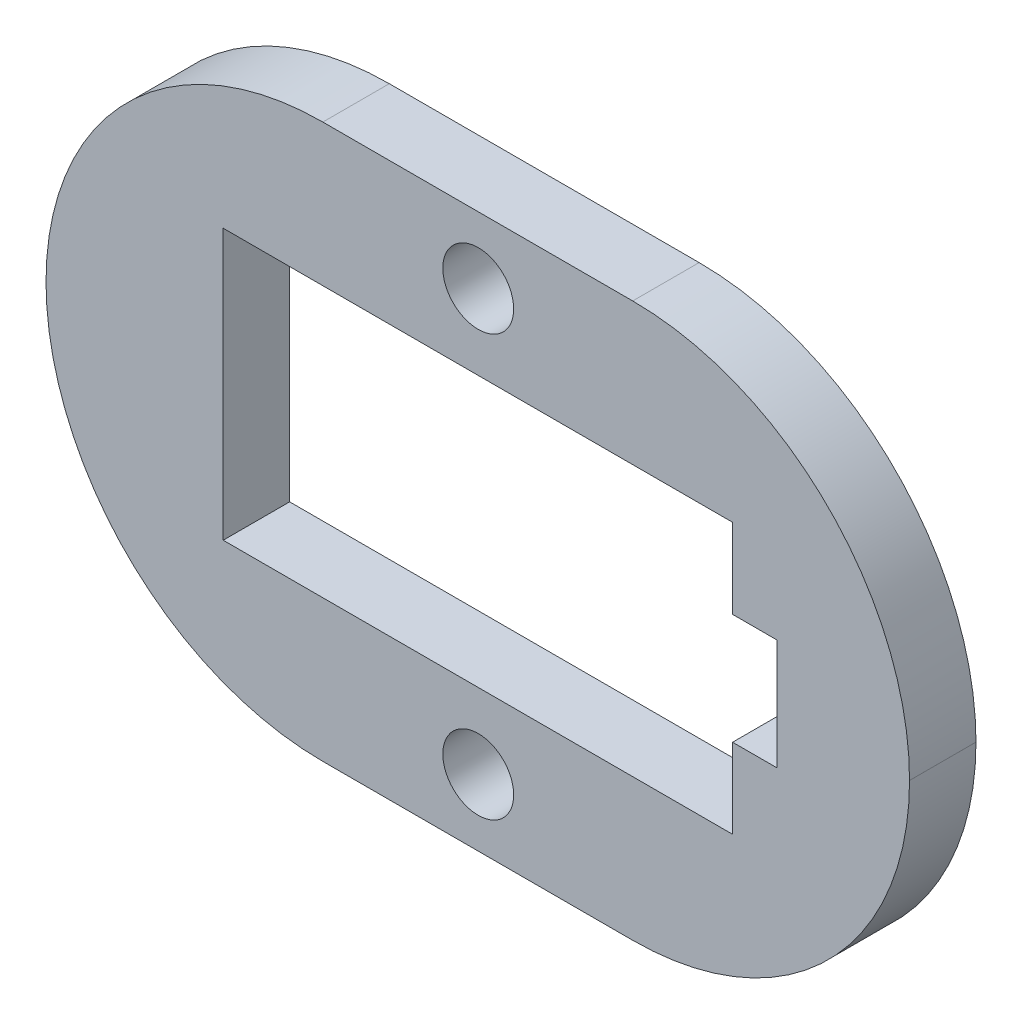
ISO-10303-21;
HEADER;
FILE_DESCRIPTION(('STEP AP214'),'2;1');
FILE_NAME('part.step','',(''),(''),'','','');
FILE_SCHEMA(('AUTOMOTIVE_DESIGN { 1 0 10303 214 1 1 1 1 }'));
ENDSEC;
DATA;
#1=APPLICATION_CONTEXT('core data for automotive mechanical design processes');
#2=APPLICATION_PROTOCOL_DEFINITION('international standard','automotive_design',2000,#1);
#3=PRODUCT_CONTEXT('',#1,'mechanical');
#4=PRODUCT('Part','Part','',(#3));
#5=PRODUCT_RELATED_PRODUCT_CATEGORY('part','',(#4));
#6=PRODUCT_DEFINITION_FORMATION('','',#4);
#7=PRODUCT_DEFINITION_CONTEXT('part definition',#1,'design');
#8=PRODUCT_DEFINITION('design','',#6,#7);
#9=PRODUCT_DEFINITION_SHAPE('','',#8);
#10=(LENGTH_UNIT() NAMED_UNIT(*) SI_UNIT(.MILLI.,.METRE.));
#11=(NAMED_UNIT(*) PLANE_ANGLE_UNIT() SI_UNIT($,.RADIAN.));
#12=(NAMED_UNIT(*) SI_UNIT($,.STERADIAN.) SOLID_ANGLE_UNIT());
#13=UNCERTAINTY_MEASURE_WITH_UNIT(LENGTH_MEASURE(1.E-05),#10,'distance_accuracy_value','');
#14=(GEOMETRIC_REPRESENTATION_CONTEXT(3) GLOBAL_UNCERTAINTY_ASSIGNED_CONTEXT((#13)) GLOBAL_UNIT_ASSIGNED_CONTEXT((#10,
#11,#12)) REPRESENTATION_CONTEXT('',''));
#15=CARTESIAN_POINT('',(0.,0.,0.));
#16=DIRECTION('',(0.,0.,1.));
#17=DIRECTION('',(1.,0.,0.));
#18=AXIS2_PLACEMENT_3D('',#15,#16,#17);
#19=CARTESIAN_POINT('',(-8.50332149258777,12.5,3.));
#20=DIRECTION('',(0.,0.,-1.));
#21=DIRECTION('',(-1.,0.,0.));
#22=AXIS2_PLACEMENT_3D('',#19,#20,#21);
#23=CYLINDRICAL_SURFACE('',#22,12.5);
#24=CARTESIAN_POINT('',(-8.50332149258777,12.5,0.));
#25=DIRECTION('',(0.,0.,-1.));
#26=DIRECTION('',(-1.,0.,0.));
#27=AXIS2_PLACEMENT_3D('',#24,#25,#26);
#28=CIRCLE('',#27,12.5);
#29=CARTESIAN_POINT('',(-8.50332149258777,0.,0.));
#30=VERTEX_POINT('',#29);
#31=CARTESIAN_POINT('',(-21.0033214925878,12.5,0.));
#32=VERTEX_POINT('',#31);
#33=EDGE_CURVE('E226',#30,#32,#28,.T.);
#34=ORIENTED_EDGE('',*,*,#33,.F.);
#35=DIRECTION('',(0.,0.,-1.));
#36=VECTOR('',#35,1.);
#37=CARTESIAN_POINT('',(-8.50332149258777,0.,3.));
#38=LINE('',#37,#36);
#39=CARTESIAN_POINT('',(-8.50332149258777,0.,3.));
#40=VERTEX_POINT('',#39);
#41=EDGE_CURVE('E11',#40,#30,#38,.T.);
#42=ORIENTED_EDGE('',*,*,#41,.F.);
#43=CARTESIAN_POINT('',(-8.50332149258777,12.5,3.));
#44=DIRECTION('',(0.,0.,-1.));
#45=DIRECTION('',(-1.,0.,0.));
#46=AXIS2_PLACEMENT_3D('',#43,#44,#45);
#47=CIRCLE('',#46,12.5);
#48=CARTESIAN_POINT('',(-21.0033214925878,12.5,3.));
#49=VERTEX_POINT('',#48);
#50=EDGE_CURVE('E244',#40,#49,#47,.T.);
#51=ORIENTED_EDGE('',*,*,#50,.T.);
#52=DIRECTION('',(0.,0.,-1.));
#53=VECTOR('',#52,1.);
#54=CARTESIAN_POINT('',(-21.0033214925878,12.5,3.));
#55=LINE('',#54,#53);
#56=EDGE_CURVE('E42',#49,#32,#55,.T.);
#57=ORIENTED_EDGE('',*,*,#56,.T.);
#58=EDGE_LOOP('',(#34,#42,#51,#57));
#59=FACE_BOUND('',#58,.T.);
#60=ADVANCED_FACE('F39',(#59),#23,.T.);
#61=CARTESIAN_POINT('',(5.48658919269266,0.,3.));
#62=DIRECTION('',(0.,-1.,0.));
#63=DIRECTION('',(0.,0.,-1.));
#64=AXIS2_PLACEMENT_3D('',#61,#62,#63);
#65=PLANE('',#64);
#66=DIRECTION('',(-1.,0.,0.));
#67=VECTOR('',#66,1.);
#68=CARTESIAN_POINT('',(5.48658919269266,0.,0.));
#69=LINE('',#68,#67);
#70=CARTESIAN_POINT('',(5.48658919269266,0.,0.));
#71=VERTEX_POINT('',#70);
#72=EDGE_CURVE('E249',#71,#30,#69,.T.);
#73=ORIENTED_EDGE('',*,*,#72,.F.);
#74=DIRECTION('',(0.,0.,-1.));
#75=VECTOR('',#74,1.);
#76=CARTESIAN_POINT('',(5.48658919269266,0.,3.));
#77=LINE('',#76,#75);
#78=CARTESIAN_POINT('',(5.48658919269266,0.,3.));
#79=VERTEX_POINT('',#78);
#80=EDGE_CURVE('E48',#79,#71,#77,.T.);
#81=ORIENTED_EDGE('',*,*,#80,.F.);
#82=DIRECTION('',(-1.,0.,0.));
#83=VECTOR('',#82,1.);
#84=CARTESIAN_POINT('',(5.48658919269266,0.,3.));
#85=LINE('',#84,#83);
#86=EDGE_CURVE('E269',#79,#40,#85,.T.);
#87=ORIENTED_EDGE('',*,*,#86,.T.);
#88=ORIENTED_EDGE('',*,*,#41,.T.);
#89=EDGE_LOOP('',(#73,#81,#87,#88));
#90=FACE_BOUND('',#89,.T.);
#91=ADVANCED_FACE('F325',(#90),#65,.T.);
#92=CARTESIAN_POINT('',(5.48658919269266,12.5,3.));
#93=DIRECTION('',(0.,0.,-1.));
#94=DIRECTION('',(-1.,0.,0.));
#95=AXIS2_PLACEMENT_3D('',#92,#93,#94);
#96=CYLINDRICAL_SURFACE('',#95,12.5);
#97=CARTESIAN_POINT('',(5.48658919269266,12.5,0.));
#98=DIRECTION('',(0.,0.,-1.));
#99=DIRECTION('',(-1.,0.,0.));
#100=AXIS2_PLACEMENT_3D('',#97,#98,#99);
#101=CIRCLE('',#100,12.5);
#102=CARTESIAN_POINT('',(17.9865891926927,12.5,0.));
#103=VERTEX_POINT('',#102);
#104=EDGE_CURVE('E292',#103,#71,#101,.T.);
#105=ORIENTED_EDGE('',*,*,#104,.F.);
#106=DIRECTION('',(0.,0.,-1.));
#107=VECTOR('',#106,1.);
#108=CARTESIAN_POINT('',(17.9865891926927,12.5,3.));
#109=LINE('',#108,#107);
#110=CARTESIAN_POINT('',(17.9865891926927,12.5,3.));
#111=VERTEX_POINT('',#110);
#112=EDGE_CURVE('E301',#111,#103,#109,.T.);
#113=ORIENTED_EDGE('',*,*,#112,.F.);
#114=CARTESIAN_POINT('',(5.48658919269266,12.5,3.));
#115=DIRECTION('',(0.,0.,-1.));
#116=DIRECTION('',(-1.,0.,0.));
#117=AXIS2_PLACEMENT_3D('',#114,#115,#116);
#118=CIRCLE('',#117,12.5);
#119=EDGE_CURVE('E265',#111,#79,#118,.T.);
#120=ORIENTED_EDGE('',*,*,#119,.T.);
#121=ORIENTED_EDGE('',*,*,#80,.T.);
#122=EDGE_LOOP('',(#105,#113,#120,#121));
#123=FACE_BOUND('',#122,.T.);
#124=ADVANCED_FACE('F340',(#123),#96,.T.);
#125=CARTESIAN_POINT('',(17.9865891926927,12.501,3.));
#126=DIRECTION('',(1.,0.,0.));
#127=DIRECTION('',(0.,0.,-1.));
#128=AXIS2_PLACEMENT_3D('',#125,#126,#127);
#129=PLANE('',#128);
#130=DIRECTION('',(0.,-1.,0.));
#131=VECTOR('',#130,1.);
#132=CARTESIAN_POINT('',(17.9865891926927,12.501,0.));
#133=LINE('',#132,#131);
#134=CARTESIAN_POINT('',(17.9865891926927,12.501,0.));
#135=VERTEX_POINT('',#134);
#136=EDGE_CURVE('E288',#135,#103,#133,.T.);
#137=ORIENTED_EDGE('',*,*,#136,.F.);
#138=DIRECTION('',(0.,0.,-1.));
#139=VECTOR('',#138,1.);
#140=CARTESIAN_POINT('',(17.9865891926927,12.501,3.));
#141=LINE('',#140,#139);
#142=CARTESIAN_POINT('',(17.9865891926927,12.501,3.));
#143=VERTEX_POINT('',#142);
#144=EDGE_CURVE('E304',#143,#135,#141,.T.);
#145=ORIENTED_EDGE('',*,*,#144,.F.);
#146=DIRECTION('',(0.,-1.,0.));
#147=VECTOR('',#146,1.);
#148=CARTESIAN_POINT('',(17.9865891926927,12.501,3.));
#149=LINE('',#148,#147);
#150=EDGE_CURVE('E261',#143,#111,#149,.T.);
#151=ORIENTED_EDGE('',*,*,#150,.T.);
#152=ORIENTED_EDGE('',*,*,#112,.T.);
#153=EDGE_LOOP('',(#137,#145,#151,#152));
#154=FACE_BOUND('',#153,.T.);
#155=ADVANCED_FACE('F338',(#154),#129,.T.);
#156=CARTESIAN_POINT('',(5.48658919269266,12.501,3.));
#157=DIRECTION('',(0.,0.,-1.));
#158=DIRECTION('',(-1.,0.,0.));
#159=AXIS2_PLACEMENT_3D('',#156,#157,#158);
#160=CYLINDRICAL_SURFACE('',#159,12.5);
#161=CARTESIAN_POINT('',(5.48658919269266,12.501,0.));
#162=DIRECTION('',(0.,0.,-1.));
#163=DIRECTION('',(-1.,0.,0.));
#164=AXIS2_PLACEMENT_3D('',#161,#162,#163);
#165=CIRCLE('',#164,12.5);
#166=CARTESIAN_POINT('',(5.48658919269266,25.001,0.));
#167=VERTEX_POINT('',#166);
#168=EDGE_CURVE('E284',#167,#135,#165,.T.);
#169=ORIENTED_EDGE('',*,*,#168,.F.);
#170=DIRECTION('',(0.,0.,-1.));
#171=VECTOR('',#170,1.);
#172=CARTESIAN_POINT('',(5.48658919269266,25.001,3.));
#173=LINE('',#172,#171);
#174=CARTESIAN_POINT('',(5.48658919269266,25.001,3.));
#175=VERTEX_POINT('',#174);
#176=EDGE_CURVE('E307',#175,#167,#173,.T.);
#177=ORIENTED_EDGE('',*,*,#176,.F.);
#178=CARTESIAN_POINT('',(5.48658919269266,12.501,3.));
#179=DIRECTION('',(0.,0.,-1.));
#180=DIRECTION('',(-1.,0.,0.));
#181=AXIS2_PLACEMENT_3D('',#178,#179,#180);
#182=CIRCLE('',#181,12.5);
#183=EDGE_CURVE('E257',#175,#143,#182,.T.);
#184=ORIENTED_EDGE('',*,*,#183,.T.);
#185=ORIENTED_EDGE('',*,*,#144,.T.);
#186=EDGE_LOOP('',(#169,#177,#184,#185));
#187=FACE_BOUND('',#186,.T.);
#188=ADVANCED_FACE('F336',(#187),#160,.T.);
#189=CARTESIAN_POINT('',(-8.50332151258617,25.001,3.));
#190=DIRECTION('',(0.,1.,0.));
#191=DIRECTION('',(-1.,0.,0.));
#192=AXIS2_PLACEMENT_3D('',#189,#190,#191);
#193=PLANE('',#192);
#194=DIRECTION('',(1.,0.,0.));
#195=VECTOR('',#194,1.);
#196=CARTESIAN_POINT('',(-8.50332151258617,25.001,0.));
#197=LINE('',#196,#195);
#198=CARTESIAN_POINT('',(-8.50332151258617,25.001,0.));
#199=VERTEX_POINT('',#198);
#200=EDGE_CURVE('E280',#199,#167,#197,.T.);
#201=ORIENTED_EDGE('',*,*,#200,.F.);
#202=DIRECTION('',(0.,0.,-1.));
#203=VECTOR('',#202,1.);
#204=CARTESIAN_POINT('',(-8.50332151258617,25.001,3.));
#205=LINE('',#204,#203);
#206=CARTESIAN_POINT('',(-8.50332151258617,25.001,3.));
#207=VERTEX_POINT('',#206);
#208=EDGE_CURVE('E309',#207,#199,#205,.T.);
#209=ORIENTED_EDGE('',*,*,#208,.F.);
#210=DIRECTION('',(1.,0.,0.));
#211=VECTOR('',#210,1.);
#212=CARTESIAN_POINT('',(-8.50332151258617,25.001,3.));
#213=LINE('',#212,#211);
#214=EDGE_CURVE('E253',#207,#175,#213,.T.);
#215=ORIENTED_EDGE('',*,*,#214,.T.);
#216=ORIENTED_EDGE('',*,*,#176,.T.);
#217=EDGE_LOOP('',(#201,#209,#215,#216));
#218=FACE_BOUND('',#217,.T.);
#219=ADVANCED_FACE('F332',(#218),#193,.T.);
#220=CARTESIAN_POINT('',(-8.50332151258617,12.50099998,3.));
#221=DIRECTION('',(0.,0.,-1.));
#222=DIRECTION('',(-1.,0.,0.));
#223=AXIS2_PLACEMENT_3D('',#220,#221,#222);
#224=CYLINDRICAL_SURFACE('',#223,12.50000002);
#225=CARTESIAN_POINT('',(-8.50332151258617,12.50099998,0.));
#226=DIRECTION('',(0.,0.,-1.));
#227=DIRECTION('',(-1.,0.,0.));
#228=AXIS2_PLACEMENT_3D('',#225,#226,#227);
#229=CIRCLE('',#228,12.50000002);
#230=EDGE_CURVE('E276',#32,#199,#229,.T.);
#231=ORIENTED_EDGE('',*,*,#230,.F.);
#232=ORIENTED_EDGE('',*,*,#56,.F.);
#233=CARTESIAN_POINT('',(-8.50332151258617,12.50099998,3.));
#234=DIRECTION('',(0.,0.,-1.));
#235=DIRECTION('',(-1.,0.,0.));
#236=AXIS2_PLACEMENT_3D('',#233,#234,#235);
#237=CIRCLE('',#236,12.50000002);
#238=EDGE_CURVE('E248',#49,#207,#237,.T.);
#239=ORIENTED_EDGE('',*,*,#238,.T.);
#240=ORIENTED_EDGE('',*,*,#208,.T.);
#241=EDGE_LOOP('',(#231,#232,#239,#240));
#242=FACE_BOUND('',#241,.T.);
#243=ADVANCED_FACE('F319',(#242),#224,.T.);
#244=CARTESIAN_POINT('',(-8.50332149258777,12.5,3.));
#245=DIRECTION('',(0.,0.,-1.));
#246=DIRECTION('',(-1.,0.,0.));
#247=AXIS2_PLACEMENT_3D('',#244,#245,#246);
#248=PLANE('',#247);
#249=CARTESIAN_POINT('',(-1.48790597129112,22.0005,3.));
#250=DIRECTION('',(0.,0.,1.));
#251=DIRECTION('',(1.,0.,0.));
#252=AXIS2_PLACEMENT_3D('',#249,#250,#251);
#253=CIRCLE('',#252,1.6);
#254=CARTESIAN_POINT('',(0.11209402870888,22.0005,3.));
#255=VERTEX_POINT('',#254);
#256=EDGE_CURVE('E511',#255,#255,#253,.T.);
#257=ORIENTED_EDGE('',*,*,#256,.F.);
#258=EDGE_LOOP('',(#257));
#259=FACE_BOUND('',#258,.T.);
#260=CARTESIAN_POINT('',(-1.48790597129112,2.9995,3.));
#261=DIRECTION('',(0.,0.,1.));
#262=DIRECTION('',(1.,0.,0.));
#263=AXIS2_PLACEMENT_3D('',#260,#261,#262);
#264=CIRCLE('',#263,1.6);
#265=CARTESIAN_POINT('',(0.11209402870888,2.9995,3.));
#266=VERTEX_POINT('',#265);
#267=EDGE_CURVE('E176',#266,#266,#264,.T.);
#268=ORIENTED_EDGE('',*,*,#267,.F.);
#269=EDGE_LOOP('',(#268));
#270=FACE_BOUND('',#269,.T.);
#271=DIRECTION('',(1.,0.,0.));
#272=VECTOR('',#271,1.);
#273=CARTESIAN_POINT('',(11.9977947172437,15.,3.));
#274=LINE('',#273,#272);
#275=CARTESIAN_POINT('',(9.99689471724373,15.,3.));
#276=VERTEX_POINT('',#275);
#277=CARTESIAN_POINT('',(11.9977947172437,15.,3.));
#278=VERTEX_POINT('',#277);
#279=EDGE_CURVE('E156',#276,#278,#274,.T.);
#280=ORIENTED_EDGE('',*,*,#279,.T.);
#281=DIRECTION('',(0.,-1.,0.));
#282=VECTOR('',#281,1.);
#283=CARTESIAN_POINT('',(11.9977947172437,10.001,3.));
#284=LINE('',#283,#282);
#285=CARTESIAN_POINT('',(11.9977947172437,10.001,3.));
#286=VERTEX_POINT('',#285);
#287=EDGE_CURVE('E149',#278,#286,#284,.T.);
#288=ORIENTED_EDGE('',*,*,#287,.T.);
#289=DIRECTION('',(-1.,0.,0.));
#290=VECTOR('',#289,1.);
#291=CARTESIAN_POINT('',(9.99689471724373,10.001,3.));
#292=LINE('',#291,#290);
#293=CARTESIAN_POINT('',(9.99689471724373,10.001,3.));
#294=VERTEX_POINT('',#293);
#295=EDGE_CURVE('E159',#286,#294,#292,.T.);
#296=ORIENTED_EDGE('',*,*,#295,.T.);
#297=DIRECTION('',(0.,-1.,0.));
#298=VECTOR('',#297,1.);
#299=CARTESIAN_POINT('',(9.99689471724373,6.4,3.));
#300=LINE('',#299,#298);
#301=CARTESIAN_POINT('',(9.99689471724373,6.4,3.));
#302=VERTEX_POINT('',#301);
#303=EDGE_CURVE('E56',#294,#302,#300,.T.);
#304=ORIENTED_EDGE('',*,*,#303,.T.);
#305=DIRECTION('',(-1.,0.,0.));
#306=VECTOR('',#305,1.);
#307=CARTESIAN_POINT('',(-13.0026052827563,6.4,3.));
#308=LINE('',#307,#306);
#309=CARTESIAN_POINT('',(-13.0026052827563,6.4,3.));
#310=VERTEX_POINT('',#309);
#311=EDGE_CURVE('E181',#302,#310,#308,.T.);
#312=ORIENTED_EDGE('',*,*,#311,.T.);
#313=DIRECTION('',(0.,1.,0.));
#314=VECTOR('',#313,1.);
#315=CARTESIAN_POINT('',(-13.0026052827563,18.6,3.));
#316=LINE('',#315,#314);
#317=CARTESIAN_POINT('',(-13.0026052827563,18.6,3.));
#318=VERTEX_POINT('',#317);
#319=EDGE_CURVE('E185',#310,#318,#316,.T.);
#320=ORIENTED_EDGE('',*,*,#319,.T.);
#321=DIRECTION('',(1.,0.,0.));
#322=VECTOR('',#321,1.);
#323=CARTESIAN_POINT('',(9.99689471724373,18.6,3.));
#324=LINE('',#323,#322);
#325=CARTESIAN_POINT('',(9.99689471724373,18.6,3.));
#326=VERTEX_POINT('',#325);
#327=EDGE_CURVE('E189',#318,#326,#324,.T.);
#328=ORIENTED_EDGE('',*,*,#327,.T.);
#329=DIRECTION('',(0.,-1.,0.));
#330=VECTOR('',#329,1.);
#331=CARTESIAN_POINT('',(9.99689471724373,15.,3.));
#332=LINE('',#331,#330);
#333=EDGE_CURVE('E193',#326,#276,#332,.T.);
#334=ORIENTED_EDGE('',*,*,#333,.T.);
#335=EDGE_LOOP('',(#280,#288,#296,#304,#312,#320,#328,#334));
#336=FACE_BOUND('',#335,.T.);
#337=ORIENTED_EDGE('',*,*,#50,.F.);
#338=ORIENTED_EDGE('',*,*,#86,.F.);
#339=ORIENTED_EDGE('',*,*,#119,.F.);
#340=ORIENTED_EDGE('',*,*,#150,.F.);
#341=ORIENTED_EDGE('',*,*,#183,.F.);
#342=ORIENTED_EDGE('',*,*,#214,.F.);
#343=ORIENTED_EDGE('',*,*,#238,.F.);
#344=EDGE_LOOP('',(#337,#338,#339,#340,#341,#342,#343));
#345=FACE_BOUND('',#344,.T.);
#346=ADVANCED_FACE('F164',(#259,#270,#336,#345),#248,.F.);
#347=CARTESIAN_POINT('',(-8.50332149258777,12.5,0.));
#348=DIRECTION('',(0.,0.,-1.));
#349=DIRECTION('',(-1.,0.,0.));
#350=AXIS2_PLACEMENT_3D('',#347,#348,#349);
#351=PLANE('',#350);
#352=CARTESIAN_POINT('',(-1.48790597129112,22.0005,0.));
#353=DIRECTION('',(0.,0.,1.));
#354=DIRECTION('',(1.,0.,0.));
#355=AXIS2_PLACEMENT_3D('',#352,#353,#354);
#356=CIRCLE('',#355,1.6);
#357=CARTESIAN_POINT('',(0.11209402870888,22.0005,0.));
#358=VERTEX_POINT('',#357);
#359=EDGE_CURVE('E201',#358,#358,#356,.T.);
#360=ORIENTED_EDGE('',*,*,#359,.T.);
#361=EDGE_LOOP('',(#360));
#362=FACE_BOUND('',#361,.T.);
#363=CARTESIAN_POINT('',(-1.48790597129112,2.9995,0.));
#364=DIRECTION('',(0.,0.,1.));
#365=DIRECTION('',(1.,0.,0.));
#366=AXIS2_PLACEMENT_3D('',#363,#364,#365);
#367=CIRCLE('',#366,1.6);
#368=CARTESIAN_POINT('',(0.11209402870888,2.9995,0.));
#369=VERTEX_POINT('',#368);
#370=EDGE_CURVE('E513',#369,#369,#367,.T.);
#371=ORIENTED_EDGE('',*,*,#370,.T.);
#372=EDGE_LOOP('',(#371));
#373=FACE_BOUND('',#372,.T.);
#374=DIRECTION('',(0.,-1.,0.));
#375=VECTOR('',#374,1.);
#376=CARTESIAN_POINT('',(11.9977947172437,10.001,0.));
#377=LINE('',#376,#375);
#378=CARTESIAN_POINT('',(11.9977947172437,15.,0.));
#379=VERTEX_POINT('',#378);
#380=CARTESIAN_POINT('',(11.9977947172437,10.001,0.));
#381=VERTEX_POINT('',#380);
#382=EDGE_CURVE('E64',#379,#381,#377,.T.);
#383=ORIENTED_EDGE('',*,*,#382,.F.);
#384=DIRECTION('',(1.,0.,0.));
#385=VECTOR('',#384,1.);
#386=CARTESIAN_POINT('',(11.9977947172437,15.,0.));
#387=LINE('',#386,#385);
#388=CARTESIAN_POINT('',(9.99689471724373,15.,0.));
#389=VERTEX_POINT('',#388);
#390=EDGE_CURVE('E169',#389,#379,#387,.T.);
#391=ORIENTED_EDGE('',*,*,#390,.F.);
#392=DIRECTION('',(0.,-1.,0.));
#393=VECTOR('',#392,1.);
#394=CARTESIAN_POINT('',(9.99689471724373,15.,0.));
#395=LINE('',#394,#393);
#396=CARTESIAN_POINT('',(9.99689471724373,18.6,0.));
#397=VERTEX_POINT('',#396);
#398=EDGE_CURVE('E173',#397,#389,#395,.T.);
#399=ORIENTED_EDGE('',*,*,#398,.F.);
#400=DIRECTION('',(1.,0.,0.));
#401=VECTOR('',#400,1.);
#402=CARTESIAN_POINT('',(9.99689471724373,18.6,0.));
#403=LINE('',#402,#401);
#404=CARTESIAN_POINT('',(-13.0026052827563,18.6,0.));
#405=VERTEX_POINT('',#404);
#406=EDGE_CURVE('E216',#405,#397,#403,.T.);
#407=ORIENTED_EDGE('',*,*,#406,.F.);
#408=DIRECTION('',(0.,1.,0.));
#409=VECTOR('',#408,1.);
#410=CARTESIAN_POINT('',(-13.0026052827563,18.6,0.));
#411=LINE('',#410,#409);
#412=CARTESIAN_POINT('',(-13.0026052827563,6.4,0.));
#413=VERTEX_POINT('',#412);
#414=EDGE_CURVE('E212',#413,#405,#411,.T.);
#415=ORIENTED_EDGE('',*,*,#414,.F.);
#416=DIRECTION('',(-1.,0.,0.));
#417=VECTOR('',#416,1.);
#418=CARTESIAN_POINT('',(-13.0026052827563,6.4,0.));
#419=LINE('',#418,#417);
#420=CARTESIAN_POINT('',(9.99689471724373,6.4,0.));
#421=VERTEX_POINT('',#420);
#422=EDGE_CURVE('E208',#421,#413,#419,.T.);
#423=ORIENTED_EDGE('',*,*,#422,.F.);
#424=DIRECTION('',(0.,-1.,0.));
#425=VECTOR('',#424,1.);
#426=CARTESIAN_POINT('',(9.99689471724373,6.4,0.));
#427=LINE('',#426,#425);
#428=CARTESIAN_POINT('',(9.99689471724373,10.001,0.));
#429=VERTEX_POINT('',#428);
#430=EDGE_CURVE('E204',#429,#421,#427,.T.);
#431=ORIENTED_EDGE('',*,*,#430,.F.);
#432=DIRECTION('',(-1.,0.,0.));
#433=VECTOR('',#432,1.);
#434=CARTESIAN_POINT('',(9.99689471724373,10.001,0.));
#435=LINE('',#434,#433);
#436=EDGE_CURVE('E200',#381,#429,#435,.T.);
#437=ORIENTED_EDGE('',*,*,#436,.F.);
#438=EDGE_LOOP('',(#383,#391,#399,#407,#415,#423,#431,#437));
#439=FACE_BOUND('',#438,.T.);
#440=ORIENTED_EDGE('',*,*,#33,.T.);
#441=ORIENTED_EDGE('',*,*,#230,.T.);
#442=ORIENTED_EDGE('',*,*,#200,.T.);
#443=ORIENTED_EDGE('',*,*,#168,.T.);
#444=ORIENTED_EDGE('',*,*,#136,.T.);
#445=ORIENTED_EDGE('',*,*,#104,.T.);
#446=ORIENTED_EDGE('',*,*,#72,.T.);
#447=EDGE_LOOP('',(#440,#441,#442,#443,#444,#445,#446));
#448=FACE_BOUND('',#447,.T.);
#449=ADVANCED_FACE('F321',(#362,#373,#439,#448),#351,.T.);
#450=CARTESIAN_POINT('',(11.9977947172437,10.001,3.));
#451=DIRECTION('',(1.,0.,0.));
#452=DIRECTION('',(0.,0.,-1.));
#453=AXIS2_PLACEMENT_3D('',#450,#451,#452);
#454=PLANE('',#453);
#455=ORIENTED_EDGE('',*,*,#382,.T.);
#456=DIRECTION('',(0.,0.,-1.));
#457=VECTOR('',#456,1.);
#458=CARTESIAN_POINT('',(11.9977947172437,10.001,3.));
#459=LINE('',#458,#457);
#460=EDGE_CURVE('E145',#286,#381,#459,.T.);
#461=ORIENTED_EDGE('',*,*,#460,.F.);
#462=ORIENTED_EDGE('',*,*,#287,.F.);
#463=DIRECTION('',(0.,0.,-1.));
#464=VECTOR('',#463,1.);
#465=CARTESIAN_POINT('',(11.9977947172437,15.,3.));
#466=LINE('',#465,#464);
#467=EDGE_CURVE('E223',#278,#379,#466,.T.);
#468=ORIENTED_EDGE('',*,*,#467,.T.);
#469=EDGE_LOOP('',(#455,#461,#462,#468));
#470=FACE_BOUND('',#469,.T.);
#471=ADVANCED_FACE('F147',(#470),#454,.F.);
#472=CARTESIAN_POINT('',(11.9977947172437,15.,3.));
#473=DIRECTION('',(0.,1.,0.));
#474=DIRECTION('',(0.,0.,1.));
#475=AXIS2_PLACEMENT_3D('',#472,#473,#474);
#476=PLANE('',#475);
#477=ORIENTED_EDGE('',*,*,#390,.T.);
#478=ORIENTED_EDGE('',*,*,#467,.F.);
#479=ORIENTED_EDGE('',*,*,#279,.F.);
#480=DIRECTION('',(0.,0.,-1.));
#481=VECTOR('',#480,1.);
#482=CARTESIAN_POINT('',(9.99689471724373,15.,3.));
#483=LINE('',#482,#481);
#484=EDGE_CURVE('E227',#276,#389,#483,.T.);
#485=ORIENTED_EDGE('',*,*,#484,.T.);
#486=EDGE_LOOP('',(#477,#478,#479,#485));
#487=FACE_BOUND('',#486,.T.);
#488=ADVANCED_FACE('F400',(#487),#476,.F.);
#489=CARTESIAN_POINT('',(9.99689471724373,15.,3.));
#490=DIRECTION('',(1.,0.,0.));
#491=DIRECTION('',(0.,0.,-1.));
#492=AXIS2_PLACEMENT_3D('',#489,#490,#491);
#493=PLANE('',#492);
#494=ORIENTED_EDGE('',*,*,#398,.T.);
#495=ORIENTED_EDGE('',*,*,#484,.F.);
#496=ORIENTED_EDGE('',*,*,#333,.F.);
#497=DIRECTION('',(0.,0.,-1.));
#498=VECTOR('',#497,1.);
#499=CARTESIAN_POINT('',(9.99689471724373,18.6,3.));
#500=LINE('',#499,#498);
#501=EDGE_CURVE('E230',#326,#397,#500,.T.);
#502=ORIENTED_EDGE('',*,*,#501,.T.);
#503=EDGE_LOOP('',(#494,#495,#496,#502));
#504=FACE_BOUND('',#503,.T.);
#505=ADVANCED_FACE('F411',(#504),#493,.F.);
#506=CARTESIAN_POINT('',(9.99689471724373,18.6,3.));
#507=DIRECTION('',(0.,1.,0.));
#508=DIRECTION('',(0.,0.,1.));
#509=AXIS2_PLACEMENT_3D('',#506,#507,#508);
#510=PLANE('',#509);
#511=ORIENTED_EDGE('',*,*,#406,.T.);
#512=ORIENTED_EDGE('',*,*,#501,.F.);
#513=ORIENTED_EDGE('',*,*,#327,.F.);
#514=DIRECTION('',(0.,0.,-1.));
#515=VECTOR('',#514,1.);
#516=CARTESIAN_POINT('',(-13.0026052827563,18.6,3.));
#517=LINE('',#516,#515);
#518=EDGE_CURVE('E233',#318,#405,#517,.T.);
#519=ORIENTED_EDGE('',*,*,#518,.T.);
#520=EDGE_LOOP('',(#511,#512,#513,#519));
#521=FACE_BOUND('',#520,.T.);
#522=ADVANCED_FACE('F421',(#521),#510,.F.);
#523=CARTESIAN_POINT('',(-13.0026052827563,18.6,3.));
#524=DIRECTION('',(-1.,0.,0.));
#525=DIRECTION('',(0.,0.,1.));
#526=AXIS2_PLACEMENT_3D('',#523,#524,#525);
#527=PLANE('',#526);
#528=ORIENTED_EDGE('',*,*,#414,.T.);
#529=ORIENTED_EDGE('',*,*,#518,.F.);
#530=ORIENTED_EDGE('',*,*,#319,.F.);
#531=DIRECTION('',(0.,0.,-1.));
#532=VECTOR('',#531,1.);
#533=CARTESIAN_POINT('',(-13.0026052827563,6.4,3.));
#534=LINE('',#533,#532);
#535=EDGE_CURVE('E236',#310,#413,#534,.T.);
#536=ORIENTED_EDGE('',*,*,#535,.T.);
#537=EDGE_LOOP('',(#528,#529,#530,#536));
#538=FACE_BOUND('',#537,.T.);
#539=ADVANCED_FACE('F431',(#538),#527,.F.);
#540=CARTESIAN_POINT('',(-13.0026052827563,6.4,3.));
#541=DIRECTION('',(0.,-1.,0.));
#542=DIRECTION('',(1.,0.,0.));
#543=AXIS2_PLACEMENT_3D('',#540,#541,#542);
#544=PLANE('',#543);
#545=ORIENTED_EDGE('',*,*,#422,.T.);
#546=ORIENTED_EDGE('',*,*,#535,.F.);
#547=ORIENTED_EDGE('',*,*,#311,.F.);
#548=DIRECTION('',(0.,0.,-1.));
#549=VECTOR('',#548,1.);
#550=CARTESIAN_POINT('',(9.99689471724373,6.4,3.));
#551=LINE('',#550,#549);
#552=EDGE_CURVE('E239',#302,#421,#551,.T.);
#553=ORIENTED_EDGE('',*,*,#552,.T.);
#554=EDGE_LOOP('',(#545,#546,#547,#553));
#555=FACE_BOUND('',#554,.T.);
#556=ADVANCED_FACE('F441',(#555),#544,.F.);
#557=CARTESIAN_POINT('',(9.99689471724373,6.4,3.));
#558=DIRECTION('',(1.,0.,0.));
#559=DIRECTION('',(0.,0.,-1.));
#560=AXIS2_PLACEMENT_3D('',#557,#558,#559);
#561=PLANE('',#560);
#562=ORIENTED_EDGE('',*,*,#430,.T.);
#563=ORIENTED_EDGE('',*,*,#552,.F.);
#564=ORIENTED_EDGE('',*,*,#303,.F.);
#565=DIRECTION('',(0.,0.,-1.));
#566=VECTOR('',#565,1.);
#567=CARTESIAN_POINT('',(9.99689471724373,10.001,3.));
#568=LINE('',#567,#566);
#569=EDGE_CURVE('E155',#294,#429,#568,.T.);
#570=ORIENTED_EDGE('',*,*,#569,.T.);
#571=EDGE_LOOP('',(#562,#563,#564,#570));
#572=FACE_BOUND('',#571,.T.);
#573=ADVANCED_FACE('F451',(#572),#561,.F.);
#574=CARTESIAN_POINT('',(9.99689471724373,10.001,3.));
#575=DIRECTION('',(0.,-1.,0.));
#576=DIRECTION('',(0.,0.,-1.));
#577=AXIS2_PLACEMENT_3D('',#574,#575,#576);
#578=PLANE('',#577);
#579=ORIENTED_EDGE('',*,*,#436,.T.);
#580=ORIENTED_EDGE('',*,*,#569,.F.);
#581=ORIENTED_EDGE('',*,*,#295,.F.);
#582=ORIENTED_EDGE('',*,*,#460,.T.);
#583=EDGE_LOOP('',(#579,#580,#581,#582));
#584=FACE_BOUND('',#583,.T.);
#585=ADVANCED_FACE('F160',(#584),#578,.F.);
#586=CARTESIAN_POINT('',(-1.48790597129112,2.9995,0.));
#587=DIRECTION('',(0.,0.,1.));
#588=DIRECTION('',(1.,0.,0.));
#589=AXIS2_PLACEMENT_3D('',#586,#587,#588);
#590=CYLINDRICAL_SURFACE('',#589,1.6);
#591=ORIENTED_EDGE('',*,*,#370,.F.);
#592=EDGE_LOOP('',(#591));
#593=FACE_BOUND('',#592,.T.);
#594=ORIENTED_EDGE('',*,*,#267,.T.);
#595=EDGE_LOOP('',(#594));
#596=FACE_BOUND('',#595,.T.);
#597=ADVANCED_FACE('F469',(#593,#596),#590,.F.);
#598=CARTESIAN_POINT('',(-1.48790597129112,22.0005,0.));
#599=DIRECTION('',(0.,0.,1.));
#600=DIRECTION('',(1.,0.,0.));
#601=AXIS2_PLACEMENT_3D('',#598,#599,#600);
#602=CYLINDRICAL_SURFACE('',#601,1.6);
#603=ORIENTED_EDGE('',*,*,#359,.F.);
#604=EDGE_LOOP('',(#603));
#605=FACE_BOUND('',#604,.T.);
#606=ORIENTED_EDGE('',*,*,#256,.T.);
#607=EDGE_LOOP('',(#606));
#608=FACE_BOUND('',#607,.T.);
#609=ADVANCED_FACE('F492',(#605,#608),#602,.F.);
#610=CLOSED_SHELL('',(#60,#91,#124,#155,#188,#219,#243,#346,#449,#471,#488,#505,#522,#539,#556,
#573,#585,#597,#609));
#611=MANIFOLD_SOLID_BREP('B2',#610);
#612=ADVANCED_BREP_SHAPE_REPRESENTATION('',(#18,#611),#14);
#613=SHAPE_DEFINITION_REPRESENTATION(#9,#612);
ENDSEC;
END-ISO-10303-21;
